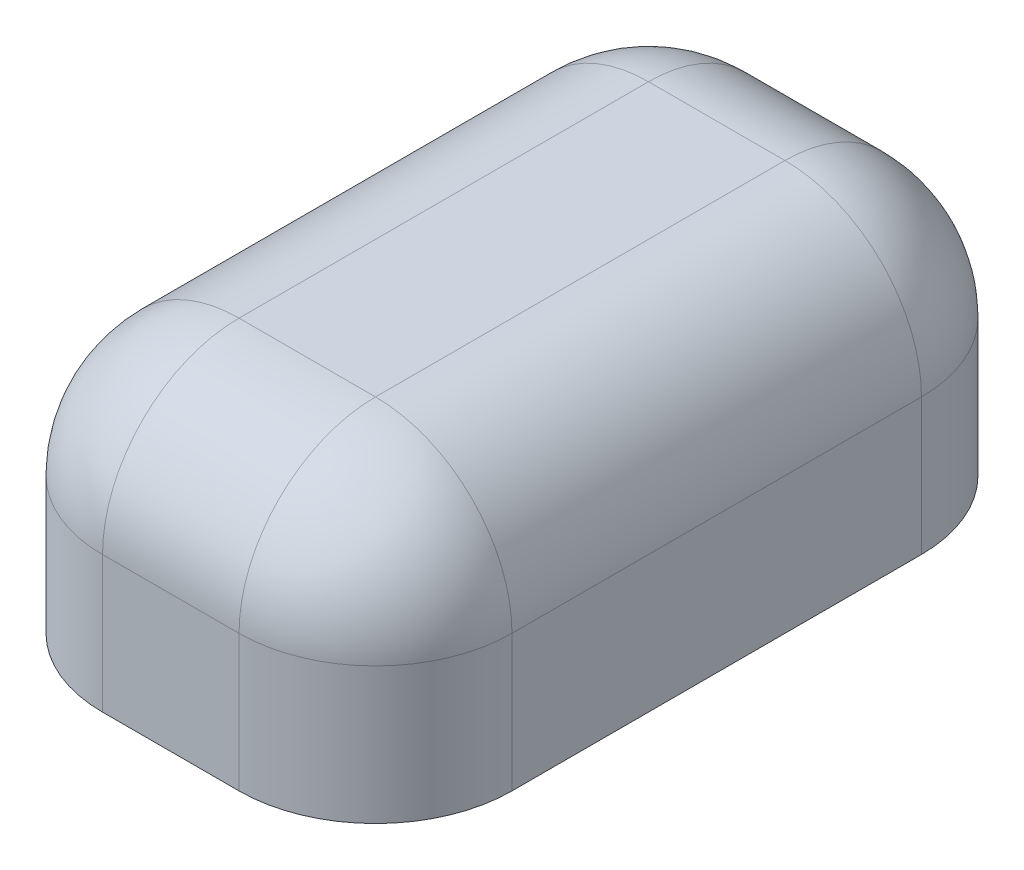
ISO-10303-21;
HEADER;
FILE_DESCRIPTION(('STEP AP214'),'2;1');
FILE_NAME('part.step','',(''),(''),'','','');
FILE_SCHEMA(('AUTOMOTIVE_DESIGN { 1 0 10303 214 1 1 1 1 }'));
ENDSEC;
DATA;
#1=APPLICATION_CONTEXT('core data for automotive mechanical design processes');
#2=APPLICATION_PROTOCOL_DEFINITION('international standard','automotive_design',2000,#1);
#3=PRODUCT_CONTEXT('',#1,'mechanical');
#4=PRODUCT('Part','Part','',(#3));
#5=PRODUCT_RELATED_PRODUCT_CATEGORY('part','',(#4));
#6=PRODUCT_DEFINITION_FORMATION('','',#4);
#7=PRODUCT_DEFINITION_CONTEXT('part definition',#1,'design');
#8=PRODUCT_DEFINITION('design','',#6,#7);
#9=PRODUCT_DEFINITION_SHAPE('','',#8);
#10=(LENGTH_UNIT() NAMED_UNIT(*) SI_UNIT(.MILLI.,.METRE.));
#11=(NAMED_UNIT(*) PLANE_ANGLE_UNIT() SI_UNIT($,.RADIAN.));
#12=(NAMED_UNIT(*) SI_UNIT($,.STERADIAN.) SOLID_ANGLE_UNIT());
#13=UNCERTAINTY_MEASURE_WITH_UNIT(LENGTH_MEASURE(1.E-05),#10,'distance_accuracy_value','');
#14=(GEOMETRIC_REPRESENTATION_CONTEXT(3) GLOBAL_UNCERTAINTY_ASSIGNED_CONTEXT((#13)) GLOBAL_UNIT_ASSIGNED_CONTEXT((#10,
#11,#12)) REPRESENTATION_CONTEXT('',''));
#15=CARTESIAN_POINT('',(0.,0.,0.));
#16=DIRECTION('',(0.,0.,1.));
#17=DIRECTION('',(1.,0.,0.));
#18=AXIS2_PLACEMENT_3D('',#15,#16,#17);
#19=CARTESIAN_POINT('',(40.5831808337319,24.,-47.5));
#20=DIRECTION('',(0.,0.,1.));
#21=DIRECTION('',(1.,0.,0.));
#22=AXIS2_PLACEMENT_3D('',#19,#20,#21);
#23=SPHERICAL_SURFACE('',#22,2.);
#24=CARTESIAN_POINT('',(40.5831808337319,24.,-47.5));
#25=DIRECTION('',(0.,-1.,0.));
#26=DIRECTION('',(0.,0.,-1.));
#27=AXIS2_PLACEMENT_3D('',#24,#25,#26);
#28=CIRCLE('',#27,2.);
#29=CARTESIAN_POINT('',(38.5831808337319,24.,-47.5));
#30=VERTEX_POINT('',#29);
#31=CARTESIAN_POINT('',(40.5831808337319,24.,-49.5));
#32=VERTEX_POINT('',#31);
#33=EDGE_CURVE('E11',#30,#32,#28,.T.);
#34=ORIENTED_EDGE('',*,*,#33,.F.);
#35=CARTESIAN_POINT('',(40.5831808337319,24.,-47.5));
#36=DIRECTION('',(0.,0.,-1.));
#37=DIRECTION('',(-1.,0.,0.));
#38=AXIS2_PLACEMENT_3D('',#35,#36,#37);
#39=CIRCLE('',#38,2.);
#40=CARTESIAN_POINT('',(40.5831808337319,26.,-47.5));
#41=VERTEX_POINT('',#40);
#42=EDGE_CURVE('E207',#41,#30,#39,.F.);
#43=ORIENTED_EDGE('',*,*,#42,.F.);
#44=CARTESIAN_POINT('',(40.5831808337319,24.,-47.5));
#45=DIRECTION('',(-1.,0.,0.));
#46=DIRECTION('',(0.,0.,1.));
#47=AXIS2_PLACEMENT_3D('',#44,#45,#46);
#48=CIRCLE('',#47,2.);
#49=EDGE_CURVE('E46',#41,#32,#48,.T.);
#50=ORIENTED_EDGE('',*,*,#49,.T.);
#51=EDGE_LOOP('',(#34,#43,#50));
#52=FACE_BOUND('',#51,.T.);
#53=ADVANCED_FACE('F38',(#52),#23,.T.);
#54=CARTESIAN_POINT('',(0.,24.,-47.5));
#55=DIRECTION('',(1.,0.,0.));
#56=DIRECTION('',(0.,0.,-1.));
#57=AXIS2_PLACEMENT_3D('',#54,#55,#56);
#58=CYLINDRICAL_SURFACE('',#57,2.);
#59=ORIENTED_EDGE('',*,*,#49,.F.);
#60=DIRECTION('',(-1.,0.,0.));
#61=VECTOR('',#60,1.);
#62=CARTESIAN_POINT('',(0.,26.,-47.5));
#63=LINE('',#62,#61);
#64=CARTESIAN_POINT('',(42.5831808337319,26.,-47.5));
#65=VERTEX_POINT('',#64);
#66=EDGE_CURVE('E204',#65,#41,#63,.T.);
#67=ORIENTED_EDGE('',*,*,#66,.F.);
#68=CARTESIAN_POINT('',(42.5831808337319,24.,-47.5));
#69=DIRECTION('',(-1.,0.,0.));
#70=DIRECTION('',(0.,0.,1.));
#71=AXIS2_PLACEMENT_3D('',#68,#69,#70);
#72=CIRCLE('',#71,2.);
#73=CARTESIAN_POINT('',(42.5831808337319,24.,-49.5));
#74=VERTEX_POINT('',#73);
#75=EDGE_CURVE('E215',#65,#74,#72,.T.);
#76=ORIENTED_EDGE('',*,*,#75,.T.);
#77=DIRECTION('',(-1.,0.,0.));
#78=VECTOR('',#77,1.);
#79=CARTESIAN_POINT('',(0.,24.,-49.5));
#80=LINE('',#79,#78);
#81=EDGE_CURVE('E191',#32,#74,#80,.F.);
#82=ORIENTED_EDGE('',*,*,#81,.F.);
#83=EDGE_LOOP('',(#59,#67,#76,#82));
#84=FACE_BOUND('',#83,.T.);
#85=ADVANCED_FACE('F216',(#84),#58,.T.);
#86=CARTESIAN_POINT('',(42.5831808337319,24.,-47.5));
#87=DIRECTION('',(0.,0.,1.));
#88=DIRECTION('',(1.,0.,0.));
#89=AXIS2_PLACEMENT_3D('',#86,#87,#88);
#90=SPHERICAL_SURFACE('',#89,2.);
#91=ORIENTED_EDGE('',*,*,#75,.F.);
#92=CARTESIAN_POINT('',(42.5831808337319,24.,-47.5));
#93=DIRECTION('',(0.,0.,1.));
#94=DIRECTION('',(1.,0.,0.));
#95=AXIS2_PLACEMENT_3D('',#92,#93,#94);
#96=CIRCLE('',#95,2.);
#97=CARTESIAN_POINT('',(44.5831808337319,24.,-47.5));
#98=VERTEX_POINT('',#97);
#99=EDGE_CURVE('E201',#98,#65,#96,.T.);
#100=ORIENTED_EDGE('',*,*,#99,.F.);
#101=CARTESIAN_POINT('',(42.5831808337319,24.,-47.5));
#102=DIRECTION('',(0.,1.,0.));
#103=DIRECTION('',(0.,0.,1.));
#104=AXIS2_PLACEMENT_3D('',#101,#102,#103);
#105=CIRCLE('',#104,2.);
#106=EDGE_CURVE('E212',#98,#74,#105,.T.);
#107=ORIENTED_EDGE('',*,*,#106,.T.);
#108=EDGE_LOOP('',(#91,#100,#107));
#109=FACE_BOUND('',#108,.T.);
#110=ADVANCED_FACE('F248',(#109),#90,.T.);
#111=CARTESIAN_POINT('',(42.5831808337319,26.,-47.5));
#112=DIRECTION('',(0.,1.,0.));
#113=DIRECTION('',(0.,0.,1.));
#114=AXIS2_PLACEMENT_3D('',#111,#112,#113);
#115=CYLINDRICAL_SURFACE('',#114,2.);
#116=ORIENTED_EDGE('',*,*,#106,.F.);
#117=DIRECTION('',(0.,1.,0.));
#118=VECTOR('',#117,1.);
#119=CARTESIAN_POINT('',(44.5831808337319,26.,-47.5));
#120=LINE('',#119,#118);
#121=CARTESIAN_POINT('',(44.5831808337319,22.,-47.5));
#122=VERTEX_POINT('',#121);
#123=EDGE_CURVE('E185',#122,#98,#120,.T.);
#124=ORIENTED_EDGE('',*,*,#123,.F.);
#125=CARTESIAN_POINT('',(42.5831808337319,22.,-47.5));
#126=DIRECTION('',(0.,1.,0.));
#127=DIRECTION('',(0.,0.,1.));
#128=AXIS2_PLACEMENT_3D('',#125,#126,#127);
#129=CIRCLE('',#128,2.);
#130=CARTESIAN_POINT('',(42.5831808337319,22.,-49.5));
#131=VERTEX_POINT('',#130);
#132=EDGE_CURVE('E199',#131,#122,#129,.F.);
#133=ORIENTED_EDGE('',*,*,#132,.F.);
#134=DIRECTION('',(0.,1.,0.));
#135=VECTOR('',#134,1.);
#136=CARTESIAN_POINT('',(42.5831808337319,26.,-49.5));
#137=LINE('',#136,#135);
#138=EDGE_CURVE('E194',#74,#131,#137,.F.);
#139=ORIENTED_EDGE('',*,*,#138,.F.);
#140=EDGE_LOOP('',(#116,#124,#133,#139));
#141=FACE_BOUND('',#140,.T.);
#142=ADVANCED_FACE('F254',(#141),#115,.T.);
#143=CARTESIAN_POINT('',(40.5831808337319,26.,-47.5));
#144=DIRECTION('',(0.,-1.,0.));
#145=DIRECTION('',(0.,0.,-1.));
#146=AXIS2_PLACEMENT_3D('',#143,#144,#145);
#147=CYLINDRICAL_SURFACE('',#146,2.);
#148=DIRECTION('',(0.,-1.,0.));
#149=VECTOR('',#148,1.);
#150=CARTESIAN_POINT('',(38.5831808337319,26.,-47.5));
#151=LINE('',#150,#149);
#152=CARTESIAN_POINT('',(38.5831808337319,22.,-47.5));
#153=VERTEX_POINT('',#152);
#154=EDGE_CURVE('E210',#30,#153,#151,.T.);
#155=ORIENTED_EDGE('',*,*,#154,.F.);
#156=ORIENTED_EDGE('',*,*,#33,.T.);
#157=DIRECTION('',(0.,-1.,0.));
#158=VECTOR('',#157,1.);
#159=CARTESIAN_POINT('',(40.5831808337319,26.,-49.5));
#160=LINE('',#159,#158);
#161=CARTESIAN_POINT('',(40.5831808337319,22.,-49.5));
#162=VERTEX_POINT('',#161);
#163=EDGE_CURVE('E188',#162,#32,#160,.F.);
#164=ORIENTED_EDGE('',*,*,#163,.F.);
#165=CARTESIAN_POINT('',(40.5831808337319,22.,-47.5));
#166=DIRECTION('',(0.,1.,0.));
#167=DIRECTION('',(0.,0.,1.));
#168=AXIS2_PLACEMENT_3D('',#165,#166,#167);
#169=CIRCLE('',#168,2.);
#170=EDGE_CURVE('E197',#153,#162,#169,.F.);
#171=ORIENTED_EDGE('',*,*,#170,.F.);
#172=EDGE_LOOP('',(#155,#156,#164,#171));
#173=FACE_BOUND('',#172,.T.);
#174=ADVANCED_FACE('F40',(#173),#147,.T.);
#175=CARTESIAN_POINT('',(40.5831808337319,24.,-41.5));
#176=DIRECTION('',(0.,0.,-1.));
#177=DIRECTION('',(-1.,0.,0.));
#178=AXIS2_PLACEMENT_3D('',#175,#176,#177);
#179=SPHERICAL_SURFACE('',#178,2.);
#180=CARTESIAN_POINT('',(40.5831808337319,24.,-41.5));
#181=DIRECTION('',(0.,-1.,0.));
#182=DIRECTION('',(0.,0.,-1.));
#183=AXIS2_PLACEMENT_3D('',#180,#181,#182);
#184=CIRCLE('',#183,2.);
#185=CARTESIAN_POINT('',(40.5831808337319,24.,-39.5));
#186=VERTEX_POINT('',#185);
#187=CARTESIAN_POINT('',(38.5831808337319,24.,-41.5));
#188=VERTEX_POINT('',#187);
#189=EDGE_CURVE('E183',#186,#188,#184,.T.);
#190=ORIENTED_EDGE('',*,*,#189,.F.);
#191=CARTESIAN_POINT('',(40.5831808337319,24.,-41.5));
#192=DIRECTION('',(-1.,0.,0.));
#193=DIRECTION('',(0.,0.,1.));
#194=AXIS2_PLACEMENT_3D('',#191,#192,#193);
#195=CIRCLE('',#194,2.);
#196=CARTESIAN_POINT('',(40.5831808337319,26.,-41.5));
#197=VERTEX_POINT('',#196);
#198=EDGE_CURVE('E180',#186,#197,#195,.T.);
#199=ORIENTED_EDGE('',*,*,#198,.T.);
#200=CARTESIAN_POINT('',(40.5831808337319,24.,-41.5));
#201=DIRECTION('',(0.,0.,-1.));
#202=DIRECTION('',(-1.,0.,0.));
#203=AXIS2_PLACEMENT_3D('',#200,#201,#202);
#204=CIRCLE('',#203,2.);
#205=EDGE_CURVE('E171',#188,#197,#204,.T.);
#206=ORIENTED_EDGE('',*,*,#205,.F.);
#207=EDGE_LOOP('',(#190,#199,#206));
#208=FACE_BOUND('',#207,.T.);
#209=ADVANCED_FACE('F230',(#208),#179,.T.);
#210=CARTESIAN_POINT('',(38.5831808337319,24.,-41.5));
#211=DIRECTION('',(1.,0.,0.));
#212=DIRECTION('',(0.,0.,-1.));
#213=AXIS2_PLACEMENT_3D('',#210,#211,#212);
#214=CYLINDRICAL_SURFACE('',#213,2.);
#215=ORIENTED_EDGE('',*,*,#198,.F.);
#216=DIRECTION('',(-1.,0.,0.));
#217=VECTOR('',#216,1.);
#218=CARTESIAN_POINT('',(38.5831808337319,24.,-39.5));
#219=LINE('',#218,#217);
#220=CARTESIAN_POINT('',(42.5831808337319,24.,-39.5));
#221=VERTEX_POINT('',#220);
#222=EDGE_CURVE('E133',#221,#186,#219,.T.);
#223=ORIENTED_EDGE('',*,*,#222,.F.);
#224=CARTESIAN_POINT('',(42.5831808337319,24.,-41.5));
#225=DIRECTION('',(-1.,0.,0.));
#226=DIRECTION('',(0.,0.,1.));
#227=AXIS2_PLACEMENT_3D('',#224,#225,#226);
#228=CIRCLE('',#227,2.);
#229=CARTESIAN_POINT('',(42.5831808337319,26.,-41.5));
#230=VERTEX_POINT('',#229);
#231=EDGE_CURVE('E178',#221,#230,#228,.T.);
#232=ORIENTED_EDGE('',*,*,#231,.T.);
#233=DIRECTION('',(-1.,0.,0.));
#234=VECTOR('',#233,1.);
#235=CARTESIAN_POINT('',(38.5831808337319,26.,-41.5));
#236=LINE('',#235,#234);
#237=EDGE_CURVE('E168',#197,#230,#236,.F.);
#238=ORIENTED_EDGE('',*,*,#237,.F.);
#239=EDGE_LOOP('',(#215,#223,#232,#238));
#240=FACE_BOUND('',#239,.T.);
#241=ADVANCED_FACE('F234',(#240),#214,.T.);
#242=CARTESIAN_POINT('',(42.5831808337319,24.,-41.5));
#243=DIRECTION('',(0.,0.,-1.));
#244=DIRECTION('',(-1.,0.,0.));
#245=AXIS2_PLACEMENT_3D('',#242,#243,#244);
#246=SPHERICAL_SURFACE('',#245,2.);
#247=ORIENTED_EDGE('',*,*,#231,.F.);
#248=CARTESIAN_POINT('',(42.5831808337319,24.,-41.5));
#249=DIRECTION('',(0.,1.,0.));
#250=DIRECTION('',(0.,0.,1.));
#251=AXIS2_PLACEMENT_3D('',#248,#249,#250);
#252=CIRCLE('',#251,2.);
#253=CARTESIAN_POINT('',(44.5831808337319,24.,-41.5));
#254=VERTEX_POINT('',#253);
#255=EDGE_CURVE('E175',#221,#254,#252,.T.);
#256=ORIENTED_EDGE('',*,*,#255,.T.);
#257=CARTESIAN_POINT('',(42.5831808337319,24.,-41.5));
#258=DIRECTION('',(0.,0.,1.));
#259=DIRECTION('',(1.,0.,0.));
#260=AXIS2_PLACEMENT_3D('',#257,#258,#259);
#261=CIRCLE('',#260,2.);
#262=EDGE_CURVE('E165',#230,#254,#261,.F.);
#263=ORIENTED_EDGE('',*,*,#262,.F.);
#264=EDGE_LOOP('',(#247,#256,#263));
#265=FACE_BOUND('',#264,.T.);
#266=ADVANCED_FACE('F240',(#265),#246,.T.);
#267=CARTESIAN_POINT('',(42.5831808337319,26.,-41.5));
#268=DIRECTION('',(0.,1.,0.));
#269=DIRECTION('',(0.,0.,1.));
#270=AXIS2_PLACEMENT_3D('',#267,#268,#269);
#271=CYLINDRICAL_SURFACE('',#270,2.);
#272=ORIENTED_EDGE('',*,*,#255,.F.);
#273=DIRECTION('',(0.,1.,0.));
#274=VECTOR('',#273,1.);
#275=CARTESIAN_POINT('',(42.5831808337319,26.,-39.5));
#276=LINE('',#275,#274);
#277=CARTESIAN_POINT('',(42.5831808337319,22.,-39.5));
#278=VERTEX_POINT('',#277);
#279=EDGE_CURVE('E160',#278,#221,#276,.T.);
#280=ORIENTED_EDGE('',*,*,#279,.F.);
#281=CARTESIAN_POINT('',(42.5831808337319,22.,-41.5));
#282=DIRECTION('',(0.,1.,0.));
#283=DIRECTION('',(0.,0.,1.));
#284=AXIS2_PLACEMENT_3D('',#281,#282,#283);
#285=CIRCLE('',#284,2.);
#286=CARTESIAN_POINT('',(44.5831808337319,22.,-41.5));
#287=VERTEX_POINT('',#286);
#288=EDGE_CURVE('E123',#287,#278,#285,.F.);
#289=ORIENTED_EDGE('',*,*,#288,.F.);
#290=DIRECTION('',(0.,1.,0.));
#291=VECTOR('',#290,1.);
#292=CARTESIAN_POINT('',(44.5831808337319,26.,-41.5));
#293=LINE('',#292,#291);
#294=EDGE_CURVE('E124',#254,#287,#293,.F.);
#295=ORIENTED_EDGE('',*,*,#294,.F.);
#296=EDGE_LOOP('',(#272,#280,#289,#295));
#297=FACE_BOUND('',#296,.T.);
#298=ADVANCED_FACE('F318',(#297),#271,.T.);
#299=CARTESIAN_POINT('',(40.5831808337319,26.,-41.5));
#300=DIRECTION('',(0.,-1.,0.));
#301=DIRECTION('',(0.,0.,-1.));
#302=AXIS2_PLACEMENT_3D('',#299,#300,#301);
#303=CYLINDRICAL_SURFACE('',#302,2.);
#304=DIRECTION('',(0.,-1.,0.));
#305=VECTOR('',#304,1.);
#306=CARTESIAN_POINT('',(40.5831808337319,26.,-39.5));
#307=LINE('',#306,#305);
#308=CARTESIAN_POINT('',(40.5831808337319,22.,-39.5));
#309=VERTEX_POINT('',#308);
#310=EDGE_CURVE('E117',#186,#309,#307,.T.);
#311=ORIENTED_EDGE('',*,*,#310,.F.);
#312=ORIENTED_EDGE('',*,*,#189,.T.);
#313=DIRECTION('',(0.,-1.,0.));
#314=VECTOR('',#313,1.);
#315=CARTESIAN_POINT('',(38.5831808337319,26.,-41.5));
#316=LINE('',#315,#314);
#317=CARTESIAN_POINT('',(38.5831808337319,22.,-41.5));
#318=VERTEX_POINT('',#317);
#319=EDGE_CURVE('E119',#318,#188,#316,.F.);
#320=ORIENTED_EDGE('',*,*,#319,.F.);
#321=CARTESIAN_POINT('',(40.5831808337319,22.,-41.5));
#322=DIRECTION('',(0.,1.,0.));
#323=DIRECTION('',(0.,0.,1.));
#324=AXIS2_PLACEMENT_3D('',#321,#322,#323);
#325=CIRCLE('',#324,2.);
#326=EDGE_CURVE('E114',#309,#318,#325,.F.);
#327=ORIENTED_EDGE('',*,*,#326,.F.);
#328=EDGE_LOOP('',(#311,#312,#320,#327));
#329=FACE_BOUND('',#328,.T.);
#330=ADVANCED_FACE('F116',(#329),#303,.T.);
#331=CARTESIAN_POINT('',(42.5831808337319,24.,0.));
#332=DIRECTION('',(0.,0.,1.));
#333=DIRECTION('',(1.,0.,0.));
#334=AXIS2_PLACEMENT_3D('',#331,#332,#333);
#335=CYLINDRICAL_SURFACE('',#334,2.);
#336=DIRECTION('',(0.,0.,-1.));
#337=VECTOR('',#336,1.);
#338=CARTESIAN_POINT('',(44.5831808337319,24.,0.));
#339=LINE('',#338,#337);
#340=EDGE_CURVE('E134',#98,#254,#339,.F.);
#341=ORIENTED_EDGE('',*,*,#340,.F.);
#342=ORIENTED_EDGE('',*,*,#99,.T.);
#343=DIRECTION('',(0.,0.,-1.));
#344=VECTOR('',#343,1.);
#345=CARTESIAN_POINT('',(42.5831808337319,26.,0.));
#346=LINE('',#345,#344);
#347=EDGE_CURVE('E155',#230,#65,#346,.T.);
#348=ORIENTED_EDGE('',*,*,#347,.F.);
#349=ORIENTED_EDGE('',*,*,#262,.T.);
#350=EDGE_LOOP('',(#341,#342,#348,#349));
#351=FACE_BOUND('',#350,.T.);
#352=ADVANCED_FACE('F245',(#351),#335,.T.);
#353=CARTESIAN_POINT('',(40.5831808337319,24.,0.));
#354=DIRECTION('',(0.,0.,-1.));
#355=DIRECTION('',(-1.,0.,0.));
#356=AXIS2_PLACEMENT_3D('',#353,#354,#355);
#357=CYLINDRICAL_SURFACE('',#356,2.);
#358=DIRECTION('',(0.,0.,1.));
#359=VECTOR('',#358,1.);
#360=CARTESIAN_POINT('',(40.5831808337319,26.,0.));
#361=LINE('',#360,#359);
#362=EDGE_CURVE('E150',#41,#197,#361,.T.);
#363=ORIENTED_EDGE('',*,*,#362,.F.);
#364=ORIENTED_EDGE('',*,*,#42,.T.);
#365=DIRECTION('',(0.,0.,1.));
#366=VECTOR('',#365,1.);
#367=CARTESIAN_POINT('',(38.5831808337319,24.,0.));
#368=LINE('',#367,#366);
#369=EDGE_CURVE('E152',#188,#30,#368,.F.);
#370=ORIENTED_EDGE('',*,*,#369,.F.);
#371=ORIENTED_EDGE('',*,*,#205,.T.);
#372=EDGE_LOOP('',(#363,#364,#370,#371));
#373=FACE_BOUND('',#372,.T.);
#374=ADVANCED_FACE('F226',(#373),#357,.T.);
#375=CARTESIAN_POINT('',(38.5831808337319,26.,-49.5));
#376=DIRECTION('',(1.,0.,0.));
#377=DIRECTION('',(0.,0.,-1.));
#378=AXIS2_PLACEMENT_3D('',#375,#376,#377);
#379=PLANE('',#378);
#380=ORIENTED_EDGE('',*,*,#369,.T.);
#381=ORIENTED_EDGE('',*,*,#154,.T.);
#382=DIRECTION('',(0.,0.,1.));
#383=VECTOR('',#382,1.);
#384=CARTESIAN_POINT('',(38.5831808337319,22.,-49.5));
#385=LINE('',#384,#383);
#386=EDGE_CURVE('E141',#153,#318,#385,.T.);
#387=ORIENTED_EDGE('',*,*,#386,.T.);
#388=ORIENTED_EDGE('',*,*,#319,.T.);
#389=EDGE_LOOP('',(#380,#381,#387,#388));
#390=FACE_BOUND('',#389,.T.);
#391=ADVANCED_FACE('F227',(#390),#379,.F.);
#392=CARTESIAN_POINT('',(38.5831808337319,26.,-39.5));
#393=DIRECTION('',(0.,0.,-1.));
#394=DIRECTION('',(-1.,0.,0.));
#395=AXIS2_PLACEMENT_3D('',#392,#393,#394);
#396=PLANE('',#395);
#397=DIRECTION('',(1.,0.,0.));
#398=VECTOR('',#397,1.);
#399=CARTESIAN_POINT('',(38.5831808337319,22.,-39.5));
#400=LINE('',#399,#398);
#401=EDGE_CURVE('E131',#309,#278,#400,.T.);
#402=ORIENTED_EDGE('',*,*,#401,.T.);
#403=ORIENTED_EDGE('',*,*,#279,.T.);
#404=ORIENTED_EDGE('',*,*,#222,.T.);
#405=ORIENTED_EDGE('',*,*,#310,.T.);
#406=EDGE_LOOP('',(#402,#403,#404,#405));
#407=FACE_BOUND('',#406,.T.);
#408=ADVANCED_FACE('F129',(#407),#396,.F.);
#409=CARTESIAN_POINT('',(44.5831808337319,26.,-49.5));
#410=DIRECTION('',(-1.,0.,0.));
#411=DIRECTION('',(0.,0.,1.));
#412=AXIS2_PLACEMENT_3D('',#409,#410,#411);
#413=PLANE('',#412);
#414=DIRECTION('',(0.,0.,-1.));
#415=VECTOR('',#414,1.);
#416=CARTESIAN_POINT('',(44.5831808337319,22.,-49.5));
#417=LINE('',#416,#415);
#418=EDGE_CURVE('E140',#287,#122,#417,.T.);
#419=ORIENTED_EDGE('',*,*,#418,.T.);
#420=ORIENTED_EDGE('',*,*,#123,.T.);
#421=ORIENTED_EDGE('',*,*,#340,.T.);
#422=ORIENTED_EDGE('',*,*,#294,.T.);
#423=EDGE_LOOP('',(#419,#420,#421,#422));
#424=FACE_BOUND('',#423,.T.);
#425=ADVANCED_FACE('F252',(#424),#413,.F.);
#426=CARTESIAN_POINT('',(38.5831808337319,26.,-49.5));
#427=DIRECTION('',(0.,0.,1.));
#428=DIRECTION('',(1.,0.,0.));
#429=AXIS2_PLACEMENT_3D('',#426,#427,#428);
#430=PLANE('',#429);
#431=ORIENTED_EDGE('',*,*,#81,.T.);
#432=ORIENTED_EDGE('',*,*,#138,.T.);
#433=DIRECTION('',(-1.,0.,0.));
#434=VECTOR('',#433,1.);
#435=CARTESIAN_POINT('',(38.5831808337319,22.,-49.5));
#436=LINE('',#435,#434);
#437=EDGE_CURVE('E144',#131,#162,#436,.T.);
#438=ORIENTED_EDGE('',*,*,#437,.T.);
#439=ORIENTED_EDGE('',*,*,#163,.T.);
#440=EDGE_LOOP('',(#431,#432,#438,#439));
#441=FACE_BOUND('',#440,.T.);
#442=ADVANCED_FACE('F219',(#441),#430,.F.);
#443=CARTESIAN_POINT('',(0.,26.,0.));
#444=DIRECTION('',(0.,1.,0.));
#445=DIRECTION('',(0.,0.,1.));
#446=AXIS2_PLACEMENT_3D('',#443,#444,#445);
#447=PLANE('',#446);
#448=ORIENTED_EDGE('',*,*,#347,.T.);
#449=ORIENTED_EDGE('',*,*,#66,.T.);
#450=ORIENTED_EDGE('',*,*,#362,.T.);
#451=ORIENTED_EDGE('',*,*,#237,.T.);
#452=EDGE_LOOP('',(#448,#449,#450,#451));
#453=FACE_BOUND('',#452,.T.);
#454=ADVANCED_FACE('F237',(#453),#447,.T.);
#455=CARTESIAN_POINT('',(0.,22.,0.));
#456=DIRECTION('',(0.,1.,0.));
#457=DIRECTION('',(0.,0.,1.));
#458=AXIS2_PLACEMENT_3D('',#455,#456,#457);
#459=PLANE('',#458);
#460=ORIENTED_EDGE('',*,*,#437,.F.);
#461=ORIENTED_EDGE('',*,*,#132,.T.);
#462=ORIENTED_EDGE('',*,*,#418,.F.);
#463=ORIENTED_EDGE('',*,*,#288,.T.);
#464=ORIENTED_EDGE('',*,*,#401,.F.);
#465=ORIENTED_EDGE('',*,*,#326,.T.);
#466=ORIENTED_EDGE('',*,*,#386,.F.);
#467=ORIENTED_EDGE('',*,*,#170,.T.);
#468=EDGE_LOOP('',(#460,#461,#462,#463,#464,#465,#466,#467));
#469=FACE_BOUND('',#468,.T.);
#470=ADVANCED_FACE('F137',(#469),#459,.F.);
#471=CLOSED_SHELL('',(#53,#85,#110,#142,#174,#209,#241,#266,#298,#330,#352,#374,#391,#408,#425,
#442,#454,#470));
#472=MANIFOLD_SOLID_BREP('B2',#471);
#473=ADVANCED_BREP_SHAPE_REPRESENTATION('',(#18,#472),#14);
#474=SHAPE_DEFINITION_REPRESENTATION(#9,#473);
ENDSEC;
END-ISO-10303-21;
